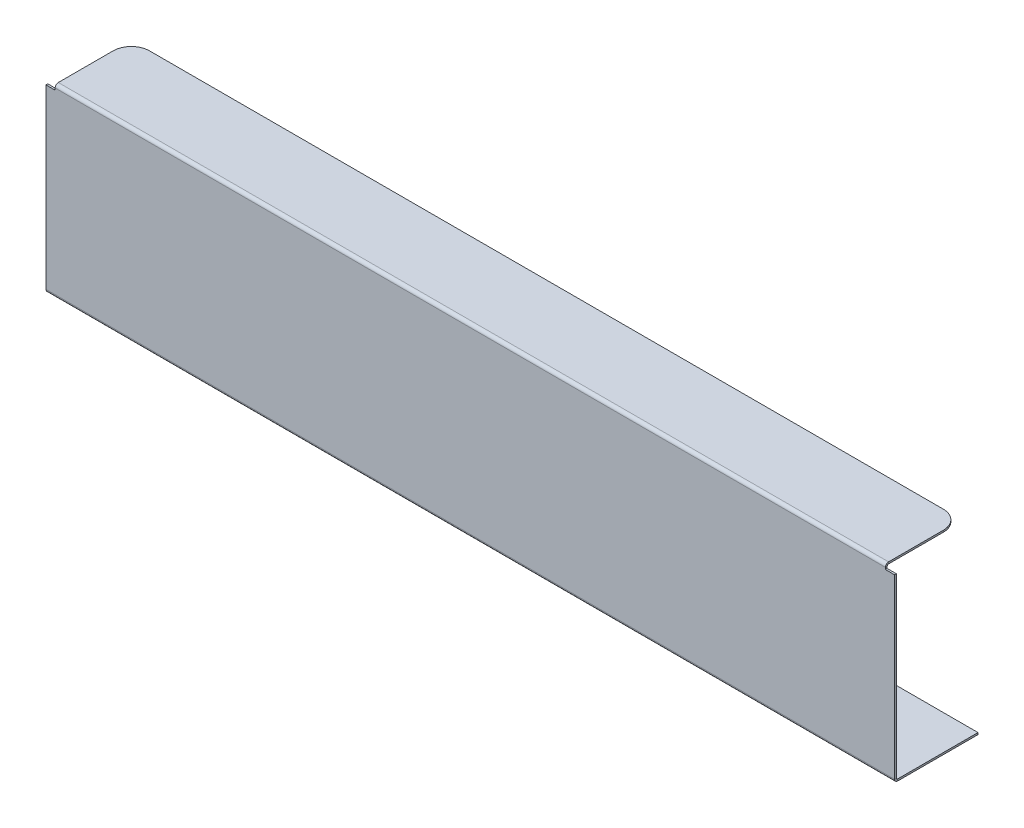
ISO-10303-21;
HEADER;
FILE_DESCRIPTION(('STEP AP214'),'2;1');
FILE_NAME('part.step','',(''),(''),'','','');
FILE_SCHEMA(('AUTOMOTIVE_DESIGN { 1 0 10303 214 1 1 1 1 }'));
ENDSEC;
DATA;
#1=APPLICATION_CONTEXT('core data for automotive mechanical design processes');
#2=APPLICATION_PROTOCOL_DEFINITION('international standard','automotive_design',2000,#1);
#3=PRODUCT_CONTEXT('',#1,'mechanical');
#4=PRODUCT('Part','Part','',(#3));
#5=PRODUCT_RELATED_PRODUCT_CATEGORY('part','',(#4));
#6=PRODUCT_DEFINITION_FORMATION('','',#4);
#7=PRODUCT_DEFINITION_CONTEXT('part definition',#1,'design');
#8=PRODUCT_DEFINITION('design','',#6,#7);
#9=PRODUCT_DEFINITION_SHAPE('','',#8);
#10=(LENGTH_UNIT() NAMED_UNIT(*) SI_UNIT(.MILLI.,.METRE.));
#11=(NAMED_UNIT(*) PLANE_ANGLE_UNIT() SI_UNIT($,.RADIAN.));
#12=(NAMED_UNIT(*) SI_UNIT($,.STERADIAN.) SOLID_ANGLE_UNIT());
#13=UNCERTAINTY_MEASURE_WITH_UNIT(LENGTH_MEASURE(1.E-05),#10,'distance_accuracy_value','');
#14=(GEOMETRIC_REPRESENTATION_CONTEXT(3) GLOBAL_UNCERTAINTY_ASSIGNED_CONTEXT((#13)) GLOBAL_UNIT_ASSIGNED_CONTEXT((#10,
#11,#12)) REPRESENTATION_CONTEXT('',''));
#15=CARTESIAN_POINT('',(0.,0.,0.));
#16=DIRECTION('',(0.,0.,1.));
#17=DIRECTION('',(1.,0.,0.));
#18=AXIS2_PLACEMENT_3D('',#15,#16,#17);
#19=CARTESIAN_POINT('',(0.,0.,0.));
#20=DIRECTION('',(0.,0.,-1.));
#21=DIRECTION('',(-1.,0.,0.));
#22=AXIS2_PLACEMENT_3D('',#19,#20,#21);
#23=PLANE('',#22);
#24=DIRECTION('',(0.,-1.,0.));
#25=VECTOR('',#24,1.);
#26=CARTESIAN_POINT('',(-232.5,-93.0000000000001,0.));
#27=LINE('',#26,#25);
#28=CARTESIAN_POINT('',(-232.5,50.,0.));
#29=VERTEX_POINT('',#28);
#30=CARTESIAN_POINT('',(-232.5,-47.0287766311428,0.));
#31=VERTEX_POINT('',#30);
#32=EDGE_CURVE('E271',#29,#31,#27,.T.);
#33=ORIENTED_EDGE('',*,*,#32,.T.);
#34=DIRECTION('',(1.,0.,0.));
#35=VECTOR('',#34,1.);
#36=CARTESIAN_POINT('',(0.,-47.0287766311428,0.));
#37=LINE('',#36,#35);
#38=CARTESIAN_POINT('',(232.5,-47.0287766311428,0.));
#39=VERTEX_POINT('',#38);
#40=EDGE_CURVE('E307',#31,#39,#37,.T.);
#41=ORIENTED_EDGE('',*,*,#40,.T.);
#42=DIRECTION('',(0.,1.,0.));
#43=VECTOR('',#42,1.);
#44=CARTESIAN_POINT('',(232.5,-93.,0.));
#45=LINE('',#44,#43);
#46=CARTESIAN_POINT('',(232.5,50.,0.));
#47=VERTEX_POINT('',#46);
#48=EDGE_CURVE('E250',#39,#47,#45,.T.);
#49=ORIENTED_EDGE('',*,*,#48,.T.);
#50=DIRECTION('',(-1.,0.,0.));
#51=VECTOR('',#50,1.);
#52=CARTESIAN_POINT('',(227.5,50.,0.));
#53=LINE('',#52,#51);
#54=CARTESIAN_POINT('',(227.5,50.,0.));
#55=VERTEX_POINT('',#54);
#56=EDGE_CURVE('E264',#47,#55,#53,.T.);
#57=ORIENTED_EDGE('',*,*,#56,.T.);
#58=DIRECTION('',(0.,1.,0.));
#59=VECTOR('',#58,1.);
#60=CARTESIAN_POINT('',(227.5,93.,0.));
#61=LINE('',#60,#59);
#62=CARTESIAN_POINT('',(227.5,51.0287766311427,0.));
#63=VERTEX_POINT('',#62);
#64=EDGE_CURVE('E267',#55,#63,#61,.T.);
#65=ORIENTED_EDGE('',*,*,#64,.T.);
#66=DIRECTION('',(1.,0.,0.));
#67=VECTOR('',#66,1.);
#68=CARTESIAN_POINT('',(0.,51.0287766311427,0.));
#69=LINE('',#68,#67);
#70=CARTESIAN_POINT('',(-227.5,51.0287766311427,0.));
#71=VERTEX_POINT('',#70);
#72=EDGE_CURVE('E289',#71,#63,#69,.T.);
#73=ORIENTED_EDGE('',*,*,#72,.F.);
#74=DIRECTION('',(0.,-1.,0.));
#75=VECTOR('',#74,1.);
#76=CARTESIAN_POINT('',(-227.5,92.9999999999999,0.));
#77=LINE('',#76,#75);
#78=CARTESIAN_POINT('',(-227.5,50.,0.));
#79=VERTEX_POINT('',#78);
#80=EDGE_CURVE('E272',#71,#79,#77,.T.);
#81=ORIENTED_EDGE('',*,*,#80,.T.);
#82=DIRECTION('',(-1.,0.,0.));
#83=VECTOR('',#82,1.);
#84=CARTESIAN_POINT('',(-227.5,50.,0.));
#85=LINE('',#84,#83);
#86=EDGE_CURVE('E268',#79,#29,#85,.T.);
#87=ORIENTED_EDGE('',*,*,#86,.T.);
#88=EDGE_LOOP('',(#33,#41,#49,#57,#65,#73,#81,#87));
#89=FACE_BOUND('',#88,.T.);
#90=ADVANCED_FACE('F44',(#89),#23,.F.);
#91=CARTESIAN_POINT('',(-227.5,92.9999999999999,-1.));
#92=DIRECTION('',(-1.,0.,0.));
#93=DIRECTION('',(0.,-1.,0.));
#94=AXIS2_PLACEMENT_3D('',#91,#92,#93);
#95=PLANE('',#94);
#96=ORIENTED_EDGE('',*,*,#80,.F.);
#97=DIRECTION('',(0.,0.,-1.));
#98=VECTOR('',#97,1.);
#99=CARTESIAN_POINT('',(-227.5,51.0287766311427,-1.));
#100=LINE('',#99,#98);
#101=CARTESIAN_POINT('',(-227.5,51.0287766311427,-1.));
#102=VERTEX_POINT('',#101);
#103=EDGE_CURVE('E286',#71,#102,#100,.T.);
#104=ORIENTED_EDGE('',*,*,#103,.T.);
#105=DIRECTION('',(0.,-1.,0.));
#106=VECTOR('',#105,1.);
#107=CARTESIAN_POINT('',(-227.5,92.9999999999999,-1.));
#108=LINE('',#107,#106);
#109=CARTESIAN_POINT('',(-227.5,50.,-1.));
#110=VERTEX_POINT('',#109);
#111=EDGE_CURVE('E263',#102,#110,#108,.T.);
#112=ORIENTED_EDGE('',*,*,#111,.T.);
#113=DIRECTION('',(0.,0.,1.));
#114=VECTOR('',#113,1.);
#115=CARTESIAN_POINT('',(-227.5,50.,-1.));
#116=LINE('',#115,#114);
#117=EDGE_CURVE('E276',#110,#79,#116,.T.);
#118=ORIENTED_EDGE('',*,*,#117,.T.);
#119=EDGE_LOOP('',(#96,#104,#112,#118));
#120=FACE_BOUND('',#119,.T.);
#121=ADVANCED_FACE('F352',(#120),#95,.T.);
#122=CARTESIAN_POINT('',(227.5,93.,-1.));
#123=DIRECTION('',(1.,0.,0.));
#124=DIRECTION('',(0.,1.,0.));
#125=AXIS2_PLACEMENT_3D('',#122,#123,#124);
#126=PLANE('',#125);
#127=DIRECTION('',(0.,1.,0.));
#128=VECTOR('',#127,1.);
#129=CARTESIAN_POINT('',(227.5,93.,-1.));
#130=LINE('',#129,#128);
#131=CARTESIAN_POINT('',(227.5,50.,-1.));
#132=VERTEX_POINT('',#131);
#133=CARTESIAN_POINT('',(227.5,51.0287766311427,-1.));
#134=VERTEX_POINT('',#133);
#135=EDGE_CURVE('E257',#132,#134,#130,.T.);
#136=ORIENTED_EDGE('',*,*,#135,.T.);
#137=DIRECTION('',(0.,0.,1.));
#138=VECTOR('',#137,1.);
#139=CARTESIAN_POINT('',(227.5,51.0287766311427,-1.));
#140=LINE('',#139,#138);
#141=EDGE_CURVE('E292',#134,#63,#140,.T.);
#142=ORIENTED_EDGE('',*,*,#141,.T.);
#143=ORIENTED_EDGE('',*,*,#64,.F.);
#144=DIRECTION('',(0.,0.,1.));
#145=VECTOR('',#144,1.);
#146=CARTESIAN_POINT('',(227.5,50.,-1.));
#147=LINE('',#146,#145);
#148=EDGE_CURVE('E279',#132,#55,#147,.T.);
#149=ORIENTED_EDGE('',*,*,#148,.F.);
#150=EDGE_LOOP('',(#136,#142,#143,#149));
#151=FACE_BOUND('',#150,.T.);
#152=ADVANCED_FACE('F360',(#151),#126,.T.);
#153=CARTESIAN_POINT('',(0.,0.,-1.));
#154=DIRECTION('',(0.,0.,-1.));
#155=DIRECTION('',(-1.,0.,0.));
#156=AXIS2_PLACEMENT_3D('',#153,#154,#155);
#157=PLANE('',#156);
#158=DIRECTION('',(1.,0.,0.));
#159=VECTOR('',#158,1.);
#160=CARTESIAN_POINT('',(0.,-47.0287766311428,-1.));
#161=LINE('',#160,#159);
#162=CARTESIAN_POINT('',(-232.5,-47.0287766311428,-1.));
#163=VERTEX_POINT('',#162);
#164=CARTESIAN_POINT('',(232.5,-47.0287766311428,-1.));
#165=VERTEX_POINT('',#164);
#166=EDGE_CURVE('E295',#163,#165,#161,.T.);
#167=ORIENTED_EDGE('',*,*,#166,.F.);
#168=DIRECTION('',(0.,-1.,0.));
#169=VECTOR('',#168,1.);
#170=CARTESIAN_POINT('',(-232.5,-93.0000000000001,-1.));
#171=LINE('',#170,#169);
#172=CARTESIAN_POINT('',(-232.5,50.,-1.));
#173=VERTEX_POINT('',#172);
#174=EDGE_CURVE('E262',#173,#163,#171,.T.);
#175=ORIENTED_EDGE('',*,*,#174,.F.);
#176=DIRECTION('',(-1.,0.,0.));
#177=VECTOR('',#176,1.);
#178=CARTESIAN_POINT('',(-227.5,50.,-1.));
#179=LINE('',#178,#177);
#180=EDGE_CURVE('E259',#110,#173,#179,.T.);
#181=ORIENTED_EDGE('',*,*,#180,.F.);
#182=ORIENTED_EDGE('',*,*,#111,.F.);
#183=DIRECTION('',(1.,0.,0.));
#184=VECTOR('',#183,1.);
#185=CARTESIAN_POINT('',(0.,51.0287766311427,-1.));
#186=LINE('',#185,#184);
#187=EDGE_CURVE('E275',#102,#134,#186,.T.);
#188=ORIENTED_EDGE('',*,*,#187,.T.);
#189=ORIENTED_EDGE('',*,*,#135,.F.);
#190=DIRECTION('',(-1.,0.,0.));
#191=VECTOR('',#190,1.);
#192=CARTESIAN_POINT('',(227.5,50.,-1.));
#193=LINE('',#192,#191);
#194=CARTESIAN_POINT('',(232.5,50.,-1.));
#195=VERTEX_POINT('',#194);
#196=EDGE_CURVE('E254',#195,#132,#193,.T.);
#197=ORIENTED_EDGE('',*,*,#196,.F.);
#198=DIRECTION('',(0.,1.,0.));
#199=VECTOR('',#198,1.);
#200=CARTESIAN_POINT('',(232.5,-93.,-1.));
#201=LINE('',#200,#199);
#202=EDGE_CURVE('E258',#165,#195,#201,.T.);
#203=ORIENTED_EDGE('',*,*,#202,.F.);
#204=EDGE_LOOP('',(#167,#175,#181,#182,#188,#189,#197,#203));
#205=FACE_BOUND('',#204,.T.);
#206=ADVANCED_FACE('F369',(#205),#157,.T.);
#207=CARTESIAN_POINT('',(232.5,-93.,-1.));
#208=DIRECTION('',(1.,0.,0.));
#209=DIRECTION('',(0.,1.,0.));
#210=AXIS2_PLACEMENT_3D('',#207,#208,#209);
#211=PLANE('',#210);
#212=DIRECTION('',(0.,0.,1.));
#213=VECTOR('',#212,1.);
#214=CARTESIAN_POINT('',(232.5,-47.0287766311428,-1.));
#215=LINE('',#214,#213);
#216=EDGE_CURVE('E304',#165,#39,#215,.T.);
#217=ORIENTED_EDGE('',*,*,#216,.F.);
#218=ORIENTED_EDGE('',*,*,#202,.T.);
#219=DIRECTION('',(0.,0.,1.));
#220=VECTOR('',#219,1.);
#221=CARTESIAN_POINT('',(232.5,50.,-1.));
#222=LINE('',#221,#220);
#223=EDGE_CURVE('E281',#195,#47,#222,.T.);
#224=ORIENTED_EDGE('',*,*,#223,.T.);
#225=ORIENTED_EDGE('',*,*,#48,.F.);
#226=EDGE_LOOP('',(#217,#218,#224,#225));
#227=FACE_BOUND('',#226,.T.);
#228=ADVANCED_FACE('F409',(#227),#211,.T.);
#229=CARTESIAN_POINT('',(-232.5,-93.0000000000001,-1.));
#230=DIRECTION('',(-1.,0.,0.));
#231=DIRECTION('',(0.,0.,1.));
#232=AXIS2_PLACEMENT_3D('',#229,#230,#231);
#233=PLANE('',#232);
#234=DIRECTION('',(0.,0.,-1.));
#235=VECTOR('',#234,1.);
#236=CARTESIAN_POINT('',(-232.5,-47.0287766311428,-1.));
#237=LINE('',#236,#235);
#238=EDGE_CURVE('E310',#31,#163,#237,.T.);
#239=ORIENTED_EDGE('',*,*,#238,.F.);
#240=ORIENTED_EDGE('',*,*,#32,.F.);
#241=DIRECTION('',(0.,0.,1.));
#242=VECTOR('',#241,1.);
#243=CARTESIAN_POINT('',(-232.5,50.,-1.));
#244=LINE('',#243,#242);
#245=EDGE_CURVE('E273',#173,#29,#244,.T.);
#246=ORIENTED_EDGE('',*,*,#245,.F.);
#247=ORIENTED_EDGE('',*,*,#174,.T.);
#248=EDGE_LOOP('',(#239,#240,#246,#247));
#249=FACE_BOUND('',#248,.T.);
#250=ADVANCED_FACE('F379',(#249),#233,.T.);
#251=CARTESIAN_POINT('',(-227.5,50.,-1.));
#252=DIRECTION('',(0.,1.,0.));
#253=DIRECTION('',(-1.,0.,0.));
#254=AXIS2_PLACEMENT_3D('',#251,#252,#253);
#255=PLANE('',#254);
#256=ORIENTED_EDGE('',*,*,#86,.F.);
#257=ORIENTED_EDGE('',*,*,#117,.F.);
#258=ORIENTED_EDGE('',*,*,#180,.T.);
#259=ORIENTED_EDGE('',*,*,#245,.T.);
#260=EDGE_LOOP('',(#256,#257,#258,#259));
#261=FACE_BOUND('',#260,.T.);
#262=ADVANCED_FACE('F374',(#261),#255,.T.);
#263=CARTESIAN_POINT('',(227.5,50.,-1.));
#264=DIRECTION('',(0.,1.,0.));
#265=DIRECTION('',(-1.,0.,0.));
#266=AXIS2_PLACEMENT_3D('',#263,#264,#265);
#267=PLANE('',#266);
#268=ORIENTED_EDGE('',*,*,#56,.F.);
#269=ORIENTED_EDGE('',*,*,#223,.F.);
#270=ORIENTED_EDGE('',*,*,#196,.T.);
#271=ORIENTED_EDGE('',*,*,#148,.T.);
#272=EDGE_LOOP('',(#268,#269,#270,#271));
#273=FACE_BOUND('',#272,.T.);
#274=ADVANCED_FACE('F411',(#273),#267,.T.);
#275=CARTESIAN_POINT('',(-227.5,51.0287766311427,-1.7366));
#276=DIRECTION('',(1.,0.,0.));
#277=DIRECTION('',(0.,0.,-1.));
#278=AXIS2_PLACEMENT_3D('',#275,#276,#277);
#279=PLANE('',#278);
#280=ORIENTED_EDGE('',*,*,#103,.F.);
#281=CARTESIAN_POINT('',(-227.5,51.0287766311427,-1.7366));
#282=DIRECTION('',(1.,0.,0.));
#283=DIRECTION('',(0.,1.,0.));
#284=AXIS2_PLACEMENT_3D('',#281,#282,#283);
#285=CIRCLE('',#284,1.7366);
#286=CARTESIAN_POINT('',(-227.5,52.7653766311427,-1.7366));
#287=VERTEX_POINT('',#286);
#288=EDGE_CURVE('E218',#71,#287,#285,.F.);
#289=ORIENTED_EDGE('',*,*,#288,.T.);
#290=DIRECTION('',(0.,-1.,0.));
#291=VECTOR('',#290,1.);
#292=CARTESIAN_POINT('',(-227.5,51.7653766311427,-1.7366));
#293=LINE('',#292,#291);
#294=CARTESIAN_POINT('',(-227.5,51.7653766311427,-1.7366));
#295=VERTEX_POINT('',#294);
#296=EDGE_CURVE('E235',#287,#295,#293,.T.);
#297=ORIENTED_EDGE('',*,*,#296,.T.);
#298=CARTESIAN_POINT('',(-227.5,51.0287766311427,-1.7366));
#299=DIRECTION('',(-1.,0.,0.));
#300=DIRECTION('',(0.,0.,-1.));
#301=AXIS2_PLACEMENT_3D('',#298,#299,#300);
#302=CIRCLE('',#301,0.736599999999995);
#303=EDGE_CURVE('E243',#102,#295,#302,.T.);
#304=ORIENTED_EDGE('',*,*,#303,.F.);
#305=EDGE_LOOP('',(#280,#289,#297,#304));
#306=FACE_BOUND('',#305,.T.);
#307=ADVANCED_FACE('F349',(#306),#279,.F.);
#308=CARTESIAN_POINT('',(227.5,51.0287766311427,-1.7366));
#309=DIRECTION('',(-1.,0.,0.));
#310=DIRECTION('',(0.,0.,1.));
#311=AXIS2_PLACEMENT_3D('',#308,#309,#310);
#312=PLANE('',#311);
#313=CARTESIAN_POINT('',(227.5,51.0287766311427,-1.7366));
#314=DIRECTION('',(1.,0.,0.));
#315=DIRECTION('',(0.,1.,0.));
#316=AXIS2_PLACEMENT_3D('',#313,#314,#315);
#317=CIRCLE('',#316,1.7366);
#318=CARTESIAN_POINT('',(227.5,52.7653766311427,-1.73660000000001));
#319=VERTEX_POINT('',#318);
#320=EDGE_CURVE('E247',#319,#63,#317,.T.);
#321=ORIENTED_EDGE('',*,*,#320,.T.);
#322=ORIENTED_EDGE('',*,*,#141,.F.);
#323=CARTESIAN_POINT('',(227.5,51.0287766311427,-1.7366));
#324=DIRECTION('',(1.,0.,0.));
#325=DIRECTION('',(0.,0.,1.));
#326=AXIS2_PLACEMENT_3D('',#323,#324,#325);
#327=CIRCLE('',#326,0.736599999999998);
#328=CARTESIAN_POINT('',(227.5,51.7653766311427,-1.7366));
#329=VERTEX_POINT('',#328);
#330=EDGE_CURVE('E246',#329,#134,#327,.T.);
#331=ORIENTED_EDGE('',*,*,#330,.F.);
#332=DIRECTION('',(0.,1.,0.));
#333=VECTOR('',#332,1.);
#334=CARTESIAN_POINT('',(227.5,51.7653766311427,-1.7366));
#335=LINE('',#334,#333);
#336=EDGE_CURVE('E238',#329,#319,#335,.T.);
#337=ORIENTED_EDGE('',*,*,#336,.T.);
#338=EDGE_LOOP('',(#321,#322,#331,#337));
#339=FACE_BOUND('',#338,.T.);
#340=ADVANCED_FACE('F364',(#339),#312,.F.);
#341=CARTESIAN_POINT('',(-455.005245133865,51.0287766311427,-1.7366));
#342=DIRECTION('',(1.,0.,0.));
#343=DIRECTION('',(0.,1.,0.));
#344=AXIS2_PLACEMENT_3D('',#341,#342,#343);
#345=CYLINDRICAL_SURFACE('',#344,0.7366);
#346=DIRECTION('',(1.,0.,0.));
#347=VECTOR('',#346,1.);
#348=CARTESIAN_POINT('',(0.,51.7653766311427,-1.7366));
#349=LINE('',#348,#347);
#350=EDGE_CURVE('E211',#295,#329,#349,.T.);
#351=ORIENTED_EDGE('',*,*,#350,.T.);
#352=ORIENTED_EDGE('',*,*,#330,.T.);
#353=ORIENTED_EDGE('',*,*,#187,.F.);
#354=ORIENTED_EDGE('',*,*,#303,.T.);
#355=EDGE_LOOP('',(#351,#352,#353,#354));
#356=FACE_BOUND('',#355,.T.);
#357=ADVANCED_FACE('F366',(#356),#345,.F.);
#358=CARTESIAN_POINT('',(-455.005245133865,51.0287766311427,-1.7366));
#359=DIRECTION('',(1.,0.,0.));
#360=DIRECTION('',(0.,1.,0.));
#361=AXIS2_PLACEMENT_3D('',#358,#359,#360);
#362=CYLINDRICAL_SURFACE('',#361,1.7366);
#363=DIRECTION('',(1.,0.,0.));
#364=VECTOR('',#363,1.);
#365=CARTESIAN_POINT('',(0.,52.7653766311427,-1.73660000000001));
#366=LINE('',#365,#364);
#367=EDGE_CURVE('E225',#287,#319,#366,.T.);
#368=ORIENTED_EDGE('',*,*,#367,.F.);
#369=ORIENTED_EDGE('',*,*,#288,.F.);
#370=ORIENTED_EDGE('',*,*,#72,.T.);
#371=ORIENTED_EDGE('',*,*,#320,.F.);
#372=EDGE_LOOP('',(#368,#369,#370,#371));
#373=FACE_BOUND('',#372,.T.);
#374=ADVANCED_FACE('F347',(#373),#362,.T.);
#375=CARTESIAN_POINT('',(227.5,51.7653766311426,-41.7653766311427));
#376=DIRECTION('',(0.,0.,-1.));
#377=DIRECTION('',(-1.,0.,0.));
#378=AXIS2_PLACEMENT_3D('',#375,#376,#377);
#379=PLANE('',#378);
#380=DIRECTION('',(-1.,0.,0.));
#381=VECTOR('',#380,1.);
#382=CARTESIAN_POINT('',(227.5,51.7653766311426,-41.7653766311427));
#383=LINE('',#382,#381);
#384=CARTESIAN_POINT('',(217.5,51.7653766311426,-41.7653766311427));
#385=VERTEX_POINT('',#384);
#386=CARTESIAN_POINT('',(-217.5,51.7653766311426,-41.7653766311427));
#387=VERTEX_POINT('',#386);
#388=EDGE_CURVE('E232',#385,#387,#383,.T.);
#389=ORIENTED_EDGE('',*,*,#388,.T.);
#390=DIRECTION('',(0.,1.,0.));
#391=VECTOR('',#390,1.);
#392=CARTESIAN_POINT('',(-217.5,51.7653766311426,-41.7653766311427));
#393=LINE('',#392,#391);
#394=CARTESIAN_POINT('',(-217.5,52.7653766311426,-41.7653766311427));
#395=VERTEX_POINT('',#394);
#396=EDGE_CURVE('E319',#387,#395,#393,.T.);
#397=ORIENTED_EDGE('',*,*,#396,.T.);
#398=DIRECTION('',(-1.,0.,0.));
#399=VECTOR('',#398,1.);
#400=CARTESIAN_POINT('',(227.5,52.7653766311426,-41.7653766311427));
#401=LINE('',#400,#399);
#402=CARTESIAN_POINT('',(217.5,52.7653766311426,-41.7653766311427));
#403=VERTEX_POINT('',#402);
#404=EDGE_CURVE('E219',#403,#395,#401,.T.);
#405=ORIENTED_EDGE('',*,*,#404,.F.);
#406=DIRECTION('',(0.,1.,0.));
#407=VECTOR('',#406,1.);
#408=CARTESIAN_POINT('',(217.5,51.7653766311426,-41.7653766311427));
#409=LINE('',#408,#407);
#410=EDGE_CURVE('E313',#403,#385,#409,.F.);
#411=ORIENTED_EDGE('',*,*,#410,.T.);
#412=EDGE_LOOP('',(#389,#397,#405,#411));
#413=FACE_BOUND('',#412,.T.);
#414=ADVANCED_FACE('F333',(#413),#379,.T.);
#415=CARTESIAN_POINT('',(0.,51.7653766311429,51.2346233688573));
#416=DIRECTION('',(0.,-1.,0.));
#417=DIRECTION('',(-1.,0.,0.));
#418=AXIS2_PLACEMENT_3D('',#415,#416,#417);
#419=PLANE('',#418);
#420=DIRECTION('',(0.,0.,1.));
#421=VECTOR('',#420,1.);
#422=CARTESIAN_POINT('',(-227.5,51.7653766311426,-41.7653766311427));
#423=LINE('',#422,#421);
#424=CARTESIAN_POINT('',(-227.5,51.7653766311426,-31.7653766311427));
#425=VERTEX_POINT('',#424);
#426=EDGE_CURVE('E230',#425,#295,#423,.T.);
#427=ORIENTED_EDGE('',*,*,#426,.F.);
#428=CARTESIAN_POINT('',(-217.5,51.7653766311426,-31.7653766311427));
#429=DIRECTION('',(0.,-1.,0.));
#430=DIRECTION('',(0.,0.,-1.));
#431=AXIS2_PLACEMENT_3D('',#428,#429,#430);
#432=CIRCLE('',#431,10.);
#433=EDGE_CURVE('E52',#425,#387,#432,.T.);
#434=ORIENTED_EDGE('',*,*,#433,.T.);
#435=ORIENTED_EDGE('',*,*,#388,.F.);
#436=CARTESIAN_POINT('',(217.5,51.7653766311426,-31.7653766311427));
#437=DIRECTION('',(0.,-1.,0.));
#438=DIRECTION('',(0.,0.,-1.));
#439=AXIS2_PLACEMENT_3D('',#436,#437,#438);
#440=CIRCLE('',#439,10.);
#441=CARTESIAN_POINT('',(227.5,51.7653766311426,-31.7653766311427));
#442=VERTEX_POINT('',#441);
#443=EDGE_CURVE('E59',#385,#442,#440,.T.);
#444=ORIENTED_EDGE('',*,*,#443,.T.);
#445=DIRECTION('',(0.,0.,-1.));
#446=VECTOR('',#445,1.);
#447=CARTESIAN_POINT('',(227.5,51.7653766311426,-41.7653766311427));
#448=LINE('',#447,#446);
#449=EDGE_CURVE('E216',#329,#442,#448,.T.);
#450=ORIENTED_EDGE('',*,*,#449,.F.);
#451=ORIENTED_EDGE('',*,*,#350,.F.);
#452=EDGE_LOOP('',(#427,#434,#435,#444,#450,#451));
#453=FACE_BOUND('',#452,.T.);
#454=ADVANCED_FACE('F328',(#453),#419,.T.);
#455=CARTESIAN_POINT('',(-227.5,51.7653766311426,-41.7653766311427));
#456=DIRECTION('',(-1.,0.,0.));
#457=DIRECTION('',(0.,0.,1.));
#458=AXIS2_PLACEMENT_3D('',#455,#456,#457);
#459=PLANE('',#458);
#460=DIRECTION('',(0.,0.,1.));
#461=VECTOR('',#460,1.);
#462=CARTESIAN_POINT('',(-227.5,52.7653766311426,-41.7653766311427));
#463=LINE('',#462,#461);
#464=CARTESIAN_POINT('',(-227.5,52.7653766311426,-31.7653766311427));
#465=VERTEX_POINT('',#464);
#466=EDGE_CURVE('E228',#465,#287,#463,.T.);
#467=ORIENTED_EDGE('',*,*,#466,.F.);
#468=DIRECTION('',(0.,1.,0.));
#469=VECTOR('',#468,1.);
#470=CARTESIAN_POINT('',(-227.5,51.7653766311426,-31.7653766311427));
#471=LINE('',#470,#469);
#472=EDGE_CURVE('E67',#465,#425,#471,.F.);
#473=ORIENTED_EDGE('',*,*,#472,.T.);
#474=ORIENTED_EDGE('',*,*,#426,.T.);
#475=ORIENTED_EDGE('',*,*,#296,.F.);
#476=EDGE_LOOP('',(#467,#473,#474,#475));
#477=FACE_BOUND('',#476,.T.);
#478=ADVANCED_FACE('F340',(#477),#459,.T.);
#479=CARTESIAN_POINT('',(0.,52.7653766311429,51.2346233688573));
#480=DIRECTION('',(0.,-1.,0.));
#481=DIRECTION('',(-1.,0.,0.));
#482=AXIS2_PLACEMENT_3D('',#479,#480,#481);
#483=PLANE('',#482);
#484=ORIENTED_EDGE('',*,*,#404,.T.);
#485=CARTESIAN_POINT('',(-217.5,52.7653766311426,-31.7653766311427));
#486=DIRECTION('',(0.,-1.,0.));
#487=DIRECTION('',(0.,0.,-1.));
#488=AXIS2_PLACEMENT_3D('',#485,#486,#487);
#489=CIRCLE('',#488,10.);
#490=EDGE_CURVE('E324',#395,#465,#489,.F.);
#491=ORIENTED_EDGE('',*,*,#490,.T.);
#492=ORIENTED_EDGE('',*,*,#466,.T.);
#493=ORIENTED_EDGE('',*,*,#367,.T.);
#494=DIRECTION('',(0.,0.,-1.));
#495=VECTOR('',#494,1.);
#496=CARTESIAN_POINT('',(227.5,52.7653766311426,-41.7653766311427));
#497=LINE('',#496,#495);
#498=CARTESIAN_POINT('',(227.5,52.7653766311426,-31.7653766311427));
#499=VERTEX_POINT('',#498);
#500=EDGE_CURVE('E222',#319,#499,#497,.T.);
#501=ORIENTED_EDGE('',*,*,#500,.T.);
#502=CARTESIAN_POINT('',(217.5,52.7653766311426,-31.7653766311427));
#503=DIRECTION('',(0.,-1.,0.));
#504=DIRECTION('',(0.,0.,-1.));
#505=AXIS2_PLACEMENT_3D('',#502,#503,#504);
#506=CIRCLE('',#505,10.);
#507=EDGE_CURVE('E322',#499,#403,#506,.F.);
#508=ORIENTED_EDGE('',*,*,#507,.T.);
#509=EDGE_LOOP('',(#484,#491,#492,#493,#501,#508));
#510=FACE_BOUND('',#509,.T.);
#511=ADVANCED_FACE('F338',(#510),#483,.F.);
#512=CARTESIAN_POINT('',(227.5,51.7653766311426,-41.7653766311427));
#513=DIRECTION('',(1.,0.,0.));
#514=DIRECTION('',(0.,0.,-1.));
#515=AXIS2_PLACEMENT_3D('',#512,#513,#514);
#516=PLANE('',#515);
#517=ORIENTED_EDGE('',*,*,#449,.T.);
#518=DIRECTION('',(0.,1.,0.));
#519=VECTOR('',#518,1.);
#520=CARTESIAN_POINT('',(227.5,51.7653766311426,-31.7653766311427));
#521=LINE('',#520,#519);
#522=EDGE_CURVE('E12',#442,#499,#521,.T.);
#523=ORIENTED_EDGE('',*,*,#522,.T.);
#524=ORIENTED_EDGE('',*,*,#500,.F.);
#525=ORIENTED_EDGE('',*,*,#336,.F.);
#526=EDGE_LOOP('',(#517,#523,#524,#525));
#527=FACE_BOUND('',#526,.T.);
#528=ADVANCED_FACE('F451',(#527),#516,.T.);
#529=CARTESIAN_POINT('',(-232.5,-47.0287766311428,-1.7366));
#530=DIRECTION('',(1.,0.,0.));
#531=DIRECTION('',(0.,0.,-1.));
#532=AXIS2_PLACEMENT_3D('',#529,#530,#531);
#533=PLANE('',#532);
#534=DIRECTION('',(0.,1.,0.));
#535=VECTOR('',#534,1.);
#536=CARTESIAN_POINT('',(-232.5,-47.7653766311428,-1.73660000000001));
#537=LINE('',#536,#535);
#538=CARTESIAN_POINT('',(-232.5,-48.7653766311428,-1.73660000000001));
#539=VERTEX_POINT('',#538);
#540=CARTESIAN_POINT('',(-232.5,-47.7653766311428,-1.7366));
#541=VERTEX_POINT('',#540);
#542=EDGE_CURVE('E178',#539,#541,#537,.T.);
#543=ORIENTED_EDGE('',*,*,#542,.F.);
#544=CARTESIAN_POINT('',(-232.5,-47.0287766311428,-1.7366));
#545=DIRECTION('',(-1.,0.,0.));
#546=DIRECTION('',(0.,-1.,0.));
#547=AXIS2_PLACEMENT_3D('',#544,#545,#546);
#548=CIRCLE('',#547,1.7366);
#549=EDGE_CURVE('E189',#539,#31,#548,.T.);
#550=ORIENTED_EDGE('',*,*,#549,.T.);
#551=ORIENTED_EDGE('',*,*,#238,.T.);
#552=CARTESIAN_POINT('',(-232.5,-47.0287766311428,-1.7366));
#553=DIRECTION('',(-1.,0.,0.));
#554=DIRECTION('',(0.,0.,-1.));
#555=AXIS2_PLACEMENT_3D('',#552,#553,#554);
#556=CIRCLE('',#555,0.736599999999998);
#557=EDGE_CURVE('E204',#541,#163,#556,.T.);
#558=ORIENTED_EDGE('',*,*,#557,.F.);
#559=EDGE_LOOP('',(#543,#550,#551,#558));
#560=FACE_BOUND('',#559,.T.);
#561=ADVANCED_FACE('F386',(#560),#533,.F.);
#562=CARTESIAN_POINT('',(232.5,-47.0287766311428,-1.7366));
#563=DIRECTION('',(-1.,0.,0.));
#564=DIRECTION('',(0.,0.,1.));
#565=AXIS2_PLACEMENT_3D('',#562,#563,#564);
#566=PLANE('',#565);
#567=CARTESIAN_POINT('',(232.5,-47.0287766311428,-1.7366));
#568=DIRECTION('',(-1.,0.,0.));
#569=DIRECTION('',(0.,-1.,0.));
#570=AXIS2_PLACEMENT_3D('',#567,#568,#569);
#571=CIRCLE('',#570,1.7366);
#572=CARTESIAN_POINT('',(232.5,-48.7653766311428,-1.73660000000003));
#573=VERTEX_POINT('',#572);
#574=EDGE_CURVE('E208',#39,#573,#571,.F.);
#575=ORIENTED_EDGE('',*,*,#574,.T.);
#576=DIRECTION('',(0.,-1.,0.));
#577=VECTOR('',#576,1.);
#578=CARTESIAN_POINT('',(232.5,-47.7653766311428,-1.73660000000001));
#579=LINE('',#578,#577);
#580=CARTESIAN_POINT('',(232.5,-47.7653766311428,-1.73660000000002));
#581=VERTEX_POINT('',#580);
#582=EDGE_CURVE('E394',#581,#573,#579,.T.);
#583=ORIENTED_EDGE('',*,*,#582,.F.);
#584=CARTESIAN_POINT('',(232.5,-47.0287766311428,-1.7366));
#585=DIRECTION('',(1.,0.,0.));
#586=DIRECTION('',(0.,0.,1.));
#587=AXIS2_PLACEMENT_3D('',#584,#585,#586);
#588=CIRCLE('',#587,0.736599999999998);
#589=EDGE_CURVE('E207',#165,#581,#588,.T.);
#590=ORIENTED_EDGE('',*,*,#589,.F.);
#591=ORIENTED_EDGE('',*,*,#216,.T.);
#592=EDGE_LOOP('',(#575,#583,#590,#591));
#593=FACE_BOUND('',#592,.T.);
#594=ADVANCED_FACE('F404',(#593),#566,.F.);
#595=CARTESIAN_POINT('',(465.005132336546,-47.0287766311428,-1.7366));
#596=DIRECTION('',(-1.,0.,0.));
#597=DIRECTION('',(0.,-1.,0.));
#598=AXIS2_PLACEMENT_3D('',#595,#596,#597);
#599=CYLINDRICAL_SURFACE('',#598,0.7366);
#600=ORIENTED_EDGE('',*,*,#166,.T.);
#601=ORIENTED_EDGE('',*,*,#589,.T.);
#602=DIRECTION('',(1.,0.,0.));
#603=VECTOR('',#602,1.);
#604=CARTESIAN_POINT('',(0.,-47.7653766311428,-1.73660000000001));
#605=LINE('',#604,#603);
#606=EDGE_CURVE('E198',#541,#581,#605,.T.);
#607=ORIENTED_EDGE('',*,*,#606,.F.);
#608=ORIENTED_EDGE('',*,*,#557,.T.);
#609=EDGE_LOOP('',(#600,#601,#607,#608));
#610=FACE_BOUND('',#609,.T.);
#611=ADVANCED_FACE('F405',(#610),#599,.F.);
#612=CARTESIAN_POINT('',(465.005132336546,-47.0287766311428,-1.7366));
#613=DIRECTION('',(-1.,0.,0.));
#614=DIRECTION('',(0.,-1.,0.));
#615=AXIS2_PLACEMENT_3D('',#612,#613,#614);
#616=CYLINDRICAL_SURFACE('',#615,1.7366);
#617=ORIENTED_EDGE('',*,*,#40,.F.);
#618=ORIENTED_EDGE('',*,*,#549,.F.);
#619=DIRECTION('',(1.,0.,0.));
#620=VECTOR('',#619,1.);
#621=CARTESIAN_POINT('',(0.,-48.7653766311428,-1.73660000000002));
#622=LINE('',#621,#620);
#623=EDGE_CURVE('E196',#539,#573,#622,.T.);
#624=ORIENTED_EDGE('',*,*,#623,.T.);
#625=ORIENTED_EDGE('',*,*,#574,.F.);
#626=EDGE_LOOP('',(#617,#618,#624,#625));
#627=FACE_BOUND('',#626,.T.);
#628=ADVANCED_FACE('F385',(#627),#616,.T.);
#629=CARTESIAN_POINT('',(232.5,-47.7653766311426,-45.7653766311427));
#630=DIRECTION('',(0.,0.,-1.));
#631=DIRECTION('',(1.,0.,0.));
#632=AXIS2_PLACEMENT_3D('',#629,#630,#631);
#633=PLANE('',#632);
#634=DIRECTION('',(1.,0.,0.));
#635=VECTOR('',#634,1.);
#636=CARTESIAN_POINT('',(232.5,-48.7653766311426,-45.7653766311427));
#637=LINE('',#636,#635);
#638=CARTESIAN_POINT('',(-232.5,-48.7653766311426,-45.7653766311427));
#639=VERTEX_POINT('',#638);
#640=CARTESIAN_POINT('',(232.5,-48.7653766311426,-45.7653766311427));
#641=VERTEX_POINT('',#640);
#642=EDGE_CURVE('E188',#639,#641,#637,.T.);
#643=ORIENTED_EDGE('',*,*,#642,.F.);
#644=DIRECTION('',(0.,-1.,0.));
#645=VECTOR('',#644,1.);
#646=CARTESIAN_POINT('',(-232.5,-47.7653766311426,-45.7653766311427));
#647=LINE('',#646,#645);
#648=CARTESIAN_POINT('',(-232.5,-47.7653766311426,-45.7653766311427));
#649=VERTEX_POINT('',#648);
#650=EDGE_CURVE('E175',#649,#639,#647,.T.);
#651=ORIENTED_EDGE('',*,*,#650,.F.);
#652=DIRECTION('',(1.,0.,0.));
#653=VECTOR('',#652,1.);
#654=CARTESIAN_POINT('',(232.5,-47.7653766311426,-45.7653766311427));
#655=LINE('',#654,#653);
#656=CARTESIAN_POINT('',(232.5,-47.7653766311426,-45.7653766311427));
#657=VERTEX_POINT('',#656);
#658=EDGE_CURVE('E186',#649,#657,#655,.T.);
#659=ORIENTED_EDGE('',*,*,#658,.T.);
#660=DIRECTION('',(0.,-1.,0.));
#661=VECTOR('',#660,1.);
#662=CARTESIAN_POINT('',(232.5,-47.7653766311426,-45.7653766311427));
#663=LINE('',#662,#661);
#664=EDGE_CURVE('E195',#657,#641,#663,.T.);
#665=ORIENTED_EDGE('',*,*,#664,.T.);
#666=EDGE_LOOP('',(#643,#651,#659,#665));
#667=FACE_BOUND('',#666,.T.);
#668=ADVANCED_FACE('F185',(#667),#633,.T.);
#669=CARTESIAN_POINT('',(0.,-47.7653766311429,47.2346233688573));
#670=DIRECTION('',(0.,1.,0.));
#671=DIRECTION('',(-1.,0.,0.));
#672=AXIS2_PLACEMENT_3D('',#669,#670,#671);
#673=PLANE('',#672);
#674=DIRECTION('',(0.,0.,-1.));
#675=VECTOR('',#674,1.);
#676=CARTESIAN_POINT('',(-232.5,-47.7653766311426,-45.7653766311427));
#677=LINE('',#676,#675);
#678=EDGE_CURVE('E172',#541,#649,#677,.T.);
#679=ORIENTED_EDGE('',*,*,#678,.F.);
#680=ORIENTED_EDGE('',*,*,#606,.T.);
#681=DIRECTION('',(0.,0.,1.));
#682=VECTOR('',#681,1.);
#683=CARTESIAN_POINT('',(232.5,-47.7653766311426,-45.7653766311427));
#684=LINE('',#683,#682);
#685=EDGE_CURVE('E194',#657,#581,#684,.T.);
#686=ORIENTED_EDGE('',*,*,#685,.F.);
#687=ORIENTED_EDGE('',*,*,#658,.F.);
#688=EDGE_LOOP('',(#679,#680,#686,#687));
#689=FACE_BOUND('',#688,.T.);
#690=ADVANCED_FACE('F192',(#689),#673,.T.);
#691=CARTESIAN_POINT('',(232.5,-47.7653766311426,-45.7653766311427));
#692=DIRECTION('',(1.,0.,0.));
#693=DIRECTION('',(0.,0.,1.));
#694=AXIS2_PLACEMENT_3D('',#691,#692,#693);
#695=PLANE('',#694);
#696=ORIENTED_EDGE('',*,*,#685,.T.);
#697=ORIENTED_EDGE('',*,*,#582,.T.);
#698=DIRECTION('',(0.,0.,1.));
#699=VECTOR('',#698,1.);
#700=CARTESIAN_POINT('',(232.5,-48.7653766311426,-45.7653766311427));
#701=LINE('',#700,#699);
#702=EDGE_CURVE('E387',#641,#573,#701,.T.);
#703=ORIENTED_EDGE('',*,*,#702,.F.);
#704=ORIENTED_EDGE('',*,*,#664,.F.);
#705=EDGE_LOOP('',(#696,#697,#703,#704));
#706=FACE_BOUND('',#705,.T.);
#707=ADVANCED_FACE('F400',(#706),#695,.T.);
#708=CARTESIAN_POINT('',(0.,-48.7653766311429,47.2346233688573));
#709=DIRECTION('',(0.,1.,0.));
#710=DIRECTION('',(-1.,0.,0.));
#711=AXIS2_PLACEMENT_3D('',#708,#709,#710);
#712=PLANE('',#711);
#713=ORIENTED_EDGE('',*,*,#623,.F.);
#714=DIRECTION('',(0.,0.,-1.));
#715=VECTOR('',#714,1.);
#716=CARTESIAN_POINT('',(-232.5,-48.7653766311426,-45.7653766311427));
#717=LINE('',#716,#715);
#718=EDGE_CURVE('E392',#539,#639,#717,.T.);
#719=ORIENTED_EDGE('',*,*,#718,.T.);
#720=ORIENTED_EDGE('',*,*,#642,.T.);
#721=ORIENTED_EDGE('',*,*,#702,.T.);
#722=EDGE_LOOP('',(#713,#719,#720,#721));
#723=FACE_BOUND('',#722,.T.);
#724=ADVANCED_FACE('F436',(#723),#712,.F.);
#725=CARTESIAN_POINT('',(-232.5,-47.7653766311426,-45.7653766311427));
#726=DIRECTION('',(-1.,0.,0.));
#727=DIRECTION('',(0.,-1.,0.));
#728=AXIS2_PLACEMENT_3D('',#725,#726,#727);
#729=PLANE('',#728);
#730=ORIENTED_EDGE('',*,*,#718,.F.);
#731=ORIENTED_EDGE('',*,*,#542,.T.);
#732=ORIENTED_EDGE('',*,*,#678,.T.);
#733=ORIENTED_EDGE('',*,*,#650,.T.);
#734=EDGE_LOOP('',(#730,#731,#732,#733));
#735=FACE_BOUND('',#734,.T.);
#736=ADVANCED_FACE('F174',(#735),#729,.T.);
#737=CARTESIAN_POINT('',(-217.5,51.7653766311426,-31.7653766311427));
#738=DIRECTION('',(0.,1.,0.));
#739=DIRECTION('',(0.,0.,1.));
#740=AXIS2_PLACEMENT_3D('',#737,#738,#739);
#741=CYLINDRICAL_SURFACE('',#740,10.);
#742=ORIENTED_EDGE('',*,*,#433,.F.);
#743=ORIENTED_EDGE('',*,*,#472,.F.);
#744=ORIENTED_EDGE('',*,*,#490,.F.);
#745=ORIENTED_EDGE('',*,*,#396,.F.);
#746=EDGE_LOOP('',(#742,#743,#744,#745));
#747=FACE_BOUND('',#746,.T.);
#748=ADVANCED_FACE('F336',(#747),#741,.T.);
#749=CARTESIAN_POINT('',(217.5,51.7653766311426,-31.7653766311427));
#750=DIRECTION('',(0.,1.,0.));
#751=DIRECTION('',(0.,0.,1.));
#752=AXIS2_PLACEMENT_3D('',#749,#750,#751);
#753=CYLINDRICAL_SURFACE('',#752,10.);
#754=ORIENTED_EDGE('',*,*,#443,.F.);
#755=ORIENTED_EDGE('',*,*,#410,.F.);
#756=ORIENTED_EDGE('',*,*,#507,.F.);
#757=ORIENTED_EDGE('',*,*,#522,.F.);
#758=EDGE_LOOP('',(#754,#755,#756,#757));
#759=FACE_BOUND('',#758,.T.);
#760=ADVANCED_FACE('F46',(#759),#753,.T.);
#761=CLOSED_SHELL('',(#90,#121,#152,#206,#228,#250,#262,#274,#307,#340,#357,#374,#414,#454,#478,
#511,#528,#561,#594,#611,#628,#668,#690,#707,#724,#736,#748,#760));
#762=MANIFOLD_SOLID_BREP('B2',#761);
#763=ADVANCED_BREP_SHAPE_REPRESENTATION('',(#18,#762),#14);
#764=SHAPE_DEFINITION_REPRESENTATION(#9,#763);
ENDSEC;
END-ISO-10303-21;
